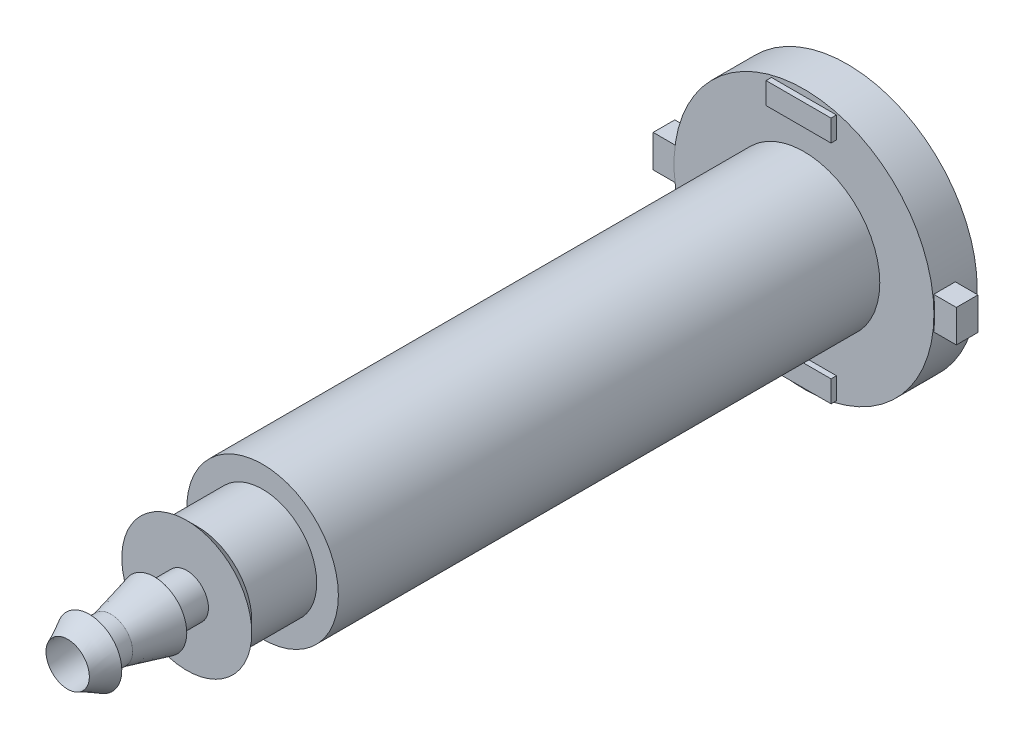
ISO-10303-21;
HEADER;
FILE_DESCRIPTION(('STEP AP214'),'2;1');
FILE_NAME('part.step','',(''),(''),'','','');
FILE_SCHEMA(('AUTOMOTIVE_DESIGN { 1 0 10303 214 1 1 1 1 }'));
ENDSEC;
DATA;
#1=APPLICATION_CONTEXT('core data for automotive mechanical design processes');
#2=APPLICATION_PROTOCOL_DEFINITION('international standard','automotive_design',2000,#1);
#3=PRODUCT_CONTEXT('',#1,'mechanical');
#4=PRODUCT('Part','Part','',(#3));
#5=PRODUCT_RELATED_PRODUCT_CATEGORY('part','',(#4));
#6=PRODUCT_DEFINITION_FORMATION('','',#4);
#7=PRODUCT_DEFINITION_CONTEXT('part definition',#1,'design');
#8=PRODUCT_DEFINITION('design','',#6,#7);
#9=PRODUCT_DEFINITION_SHAPE('','',#8);
#10=(LENGTH_UNIT() NAMED_UNIT(*) SI_UNIT(.MILLI.,.METRE.));
#11=(NAMED_UNIT(*) PLANE_ANGLE_UNIT() SI_UNIT($,.RADIAN.));
#12=(NAMED_UNIT(*) SI_UNIT($,.STERADIAN.) SOLID_ANGLE_UNIT());
#13=UNCERTAINTY_MEASURE_WITH_UNIT(LENGTH_MEASURE(1.E-05),#10,'distance_accuracy_value','');
#14=(GEOMETRIC_REPRESENTATION_CONTEXT(3) GLOBAL_UNCERTAINTY_ASSIGNED_CONTEXT((#13)) GLOBAL_UNIT_ASSIGNED_CONTEXT((#10,
#11,#12)) REPRESENTATION_CONTEXT('',''));
#15=CARTESIAN_POINT('',(0.,0.,0.));
#16=DIRECTION('',(0.,0.,1.));
#17=DIRECTION('',(1.,0.,0.));
#18=AXIS2_PLACEMENT_3D('',#15,#16,#17);
#19=CARTESIAN_POINT('',(0.,0.,9.));
#20=DIRECTION('',(0.,0.,-1.));
#21=DIRECTION('',(-1.,0.,0.));
#22=AXIS2_PLACEMENT_3D('',#19,#20,#21);
#23=CYLINDRICAL_SURFACE('',#22,9.);
#24=CARTESIAN_POINT('',(0.,0.,9.));
#25=DIRECTION('',(0.,0.,1.));
#26=DIRECTION('',(1.,0.,0.));
#27=AXIS2_PLACEMENT_3D('',#24,#25,#26);
#28=CIRCLE('',#27,9.);
#29=CARTESIAN_POINT('',(9.,0.,9.));
#30=VERTEX_POINT('',#29);
#31=EDGE_CURVE('E483',#30,#30,#28,.T.);
#32=ORIENTED_EDGE('',*,*,#31,.F.);
#33=EDGE_LOOP('',(#32));
#34=FACE_BOUND('',#33,.T.);
#35=CARTESIAN_POINT('',(0.,0.,8.));
#36=DIRECTION('',(0.,0.,-1.));
#37=DIRECTION('',(-1.,0.,0.));
#38=AXIS2_PLACEMENT_3D('',#35,#36,#37);
#39=CIRCLE('',#38,9.);
#40=CARTESIAN_POINT('',(-9.,0.,8.));
#41=VERTEX_POINT('',#40);
#42=EDGE_CURVE('E183',#41,#41,#39,.T.);
#43=ORIENTED_EDGE('',*,*,#42,.F.);
#44=EDGE_LOOP('',(#43));
#45=FACE_BOUND('',#44,.T.);
#46=ADVANCED_FACE('F50',(#34,#45),#23,.T.);
#47=CARTESIAN_POINT('',(0.,0.,13.));
#48=DIRECTION('',(0.,0.,-1.));
#49=DIRECTION('',(-1.,0.,0.));
#50=AXIS2_PLACEMENT_3D('',#47,#48,#49);
#51=CYLINDRICAL_SURFACE('',#50,12.);
#52=CARTESIAN_POINT('',(0.,0.,10.9298599072825));
#53=DIRECTION('',(0.,0.,1.));
#54=DIRECTION('',(1.,0.,0.));
#55=AXIS2_PLACEMENT_3D('',#52,#53,#54);
#56=CIRCLE('',#55,12.);
#57=CARTESIAN_POINT('',(11.9058808997907,-1.5,10.9298599072825));
#58=VERTEX_POINT('',#57);
#59=CARTESIAN_POINT('',(11.9058808997907,1.5,10.9298599072825));
#60=VERTEX_POINT('',#59);
#61=EDGE_CURVE('E410',#58,#60,#56,.T.);
#62=ORIENTED_EDGE('',*,*,#61,.F.);
#63=DIRECTION('',(0.,0.,-1.));
#64=VECTOR('',#63,1.);
#65=CARTESIAN_POINT('',(11.9058808997907,-1.5,13.));
#66=LINE('',#65,#64);
#67=CARTESIAN_POINT('',(11.9058808997907,-1.5,12.9298599072825));
#68=VERTEX_POINT('',#67);
#69=EDGE_CURVE('E422',#68,#58,#66,.T.);
#70=ORIENTED_EDGE('',*,*,#69,.F.);
#71=CARTESIAN_POINT('',(0.,0.,12.9298599072825));
#72=DIRECTION('',(0.,0.,-1.));
#73=DIRECTION('',(-1.,0.,0.));
#74=AXIS2_PLACEMENT_3D('',#71,#72,#73);
#75=CIRCLE('',#74,12.);
#76=CARTESIAN_POINT('',(11.9058808997907,1.5,12.9298599072825));
#77=VERTEX_POINT('',#76);
#78=EDGE_CURVE('E418',#77,#68,#75,.T.);
#79=ORIENTED_EDGE('',*,*,#78,.F.);
#80=DIRECTION('',(0.,0.,-1.));
#81=VECTOR('',#80,1.);
#82=CARTESIAN_POINT('',(11.9058808997907,1.5,13.));
#83=LINE('',#82,#81);
#84=EDGE_CURVE('E414',#60,#77,#83,.F.);
#85=ORIENTED_EDGE('',*,*,#84,.F.);
#86=EDGE_LOOP('',(#62,#70,#79,#85));
#87=FACE_BOUND('',#86,.T.);
#88=CARTESIAN_POINT('',(0.,0.,13.));
#89=DIRECTION('',(0.,0.,1.));
#90=DIRECTION('',(1.,0.,0.));
#91=AXIS2_PLACEMENT_3D('',#88,#89,#90);
#92=CIRCLE('',#91,12.);
#93=CARTESIAN_POINT('',(12.,0.,13.));
#94=VERTEX_POINT('',#93);
#95=EDGE_CURVE('E951',#94,#94,#92,.T.);
#96=ORIENTED_EDGE('',*,*,#95,.F.);
#97=EDGE_LOOP('',(#96));
#98=FACE_BOUND('',#97,.T.);
#99=CARTESIAN_POINT('',(0.,0.,9.));
#100=DIRECTION('',(0.,0.,1.));
#101=DIRECTION('',(1.,0.,0.));
#102=AXIS2_PLACEMENT_3D('',#99,#100,#101);
#103=CIRCLE('',#102,12.);
#104=CARTESIAN_POINT('',(12.,0.,9.));
#105=VERTEX_POINT('',#104);
#106=EDGE_CURVE('E926',#105,#105,#103,.T.);
#107=ORIENTED_EDGE('',*,*,#106,.T.);
#108=EDGE_LOOP('',(#107));
#109=FACE_BOUND('',#108,.T.);
#110=CARTESIAN_POINT('',(0.,0.,10.9298599072825));
#111=DIRECTION('',(0.,0.,1.));
#112=DIRECTION('',(1.,0.,0.));
#113=AXIS2_PLACEMENT_3D('',#110,#111,#112);
#114=CIRCLE('',#113,12.);
#115=CARTESIAN_POINT('',(-11.9058808997907,1.5,10.9298599072825));
#116=VERTEX_POINT('',#115);
#117=CARTESIAN_POINT('',(-11.9058808997907,-1.5,10.9298599072825));
#118=VERTEX_POINT('',#117);
#119=EDGE_CURVE('E12',#116,#118,#114,.T.);
#120=ORIENTED_EDGE('',*,*,#119,.F.);
#121=DIRECTION('',(0.,0.,-1.));
#122=VECTOR('',#121,1.);
#123=CARTESIAN_POINT('',(-11.9058808997907,1.5,13.));
#124=LINE('',#123,#122);
#125=CARTESIAN_POINT('',(-11.9058808997907,1.5,12.9298599072825));
#126=VERTEX_POINT('',#125);
#127=EDGE_CURVE('E406',#126,#116,#124,.T.);
#128=ORIENTED_EDGE('',*,*,#127,.F.);
#129=CARTESIAN_POINT('',(0.,0.,12.9298599072825));
#130=DIRECTION('',(0.,0.,-1.));
#131=DIRECTION('',(-1.,0.,0.));
#132=AXIS2_PLACEMENT_3D('',#129,#130,#131);
#133=CIRCLE('',#132,12.);
#134=CARTESIAN_POINT('',(-11.9058808997907,-1.5,12.9298599072825));
#135=VERTEX_POINT('',#134);
#136=EDGE_CURVE('E71',#135,#126,#133,.T.);
#137=ORIENTED_EDGE('',*,*,#136,.F.);
#138=DIRECTION('',(0.,0.,-1.));
#139=VECTOR('',#138,1.);
#140=CARTESIAN_POINT('',(-11.9058808997907,-1.5,13.));
#141=LINE('',#140,#139);
#142=EDGE_CURVE('E60',#118,#135,#141,.F.);
#143=ORIENTED_EDGE('',*,*,#142,.F.);
#144=EDGE_LOOP('',(#120,#128,#137,#143));
#145=FACE_BOUND('',#144,.T.);
#146=ADVANCED_FACE('F458',(#87,#98,#109,#145),#51,.T.);
#147=CARTESIAN_POINT('',(0.,0.,13.));
#148=DIRECTION('',(0.,0.,1.));
#149=DIRECTION('',(1.,0.,0.));
#150=AXIS2_PLACEMENT_3D('',#147,#148,#149);
#151=PLANE('',#150);
#152=CARTESIAN_POINT('',(0.,0.,13.));
#153=DIRECTION('',(0.,0.,1.));
#154=DIRECTION('',(1.,0.,0.));
#155=AXIS2_PLACEMENT_3D('',#152,#153,#154);
#156=CIRCLE('',#155,7.);
#157=CARTESIAN_POINT('',(7.,0.,13.));
#158=VERTEX_POINT('',#157);
#159=EDGE_CURVE('E930',#158,#158,#156,.T.);
#160=ORIENTED_EDGE('',*,*,#159,.F.);
#161=EDGE_LOOP('',(#160));
#162=FACE_BOUND('',#161,.T.);
#163=ORIENTED_EDGE('',*,*,#95,.T.);
#164=EDGE_LOOP('',(#163));
#165=FACE_BOUND('',#164,.T.);
#166=DIRECTION('',(-1.,0.,0.));
#167=VECTOR('',#166,1.);
#168=CARTESIAN_POINT('',(-3.,11.4282177049732,13.));
#169=LINE('',#168,#167);
#170=CARTESIAN_POINT('',(3.,11.4282177049732,13.));
#171=VERTEX_POINT('',#170);
#172=CARTESIAN_POINT('',(-3.,11.4282177049732,13.));
#173=VERTEX_POINT('',#172);
#174=EDGE_CURVE('E283',#171,#173,#169,.T.);
#175=ORIENTED_EDGE('',*,*,#174,.F.);
#176=DIRECTION('',(0.,1.,0.));
#177=VECTOR('',#176,1.);
#178=CARTESIAN_POINT('',(3.,11.4282177049732,13.));
#179=LINE('',#178,#177);
#180=CARTESIAN_POINT('',(3.,9.42821770497322,13.));
#181=VERTEX_POINT('',#180);
#182=EDGE_CURVE('E264',#181,#171,#179,.T.);
#183=ORIENTED_EDGE('',*,*,#182,.F.);
#184=DIRECTION('',(1.,0.,0.));
#185=VECTOR('',#184,1.);
#186=CARTESIAN_POINT('',(-3.,9.42821770497322,13.));
#187=LINE('',#186,#185);
#188=CARTESIAN_POINT('',(-3.,9.42821770497322,13.));
#189=VERTEX_POINT('',#188);
#190=EDGE_CURVE('E270',#189,#181,#187,.T.);
#191=ORIENTED_EDGE('',*,*,#190,.F.);
#192=DIRECTION('',(0.,-1.,0.));
#193=VECTOR('',#192,1.);
#194=CARTESIAN_POINT('',(-3.,11.4282177049732,13.));
#195=LINE('',#194,#193);
#196=EDGE_CURVE('E286',#173,#189,#195,.T.);
#197=ORIENTED_EDGE('',*,*,#196,.F.);
#198=EDGE_LOOP('',(#175,#183,#191,#197));
#199=FACE_BOUND('',#198,.T.);
#200=DIRECTION('',(1.,0.,0.));
#201=VECTOR('',#200,1.);
#202=CARTESIAN_POINT('',(3.,-11.4282177049732,13.));
#203=LINE('',#202,#201);
#204=CARTESIAN_POINT('',(-3.,-11.4282177049732,13.));
#205=VERTEX_POINT('',#204);
#206=CARTESIAN_POINT('',(3.,-11.4282177049732,13.));
#207=VERTEX_POINT('',#206);
#208=EDGE_CURVE('E193',#205,#207,#203,.T.);
#209=ORIENTED_EDGE('',*,*,#208,.F.);
#210=DIRECTION('',(0.,-1.,0.));
#211=VECTOR('',#210,1.);
#212=CARTESIAN_POINT('',(-3.,-11.4282177049732,13.));
#213=LINE('',#212,#211);
#214=CARTESIAN_POINT('',(-3.,-9.42821770497322,13.));
#215=VERTEX_POINT('',#214);
#216=EDGE_CURVE('E187',#215,#205,#213,.T.);
#217=ORIENTED_EDGE('',*,*,#216,.F.);
#218=DIRECTION('',(-1.,0.,0.));
#219=VECTOR('',#218,1.);
#220=CARTESIAN_POINT('',(3.,-9.42821770497322,13.));
#221=LINE('',#220,#219);
#222=CARTESIAN_POINT('',(3.,-9.42821770497322,13.));
#223=VERTEX_POINT('',#222);
#224=EDGE_CURVE('E204',#223,#215,#221,.T.);
#225=ORIENTED_EDGE('',*,*,#224,.F.);
#226=DIRECTION('',(0.,1.,0.));
#227=VECTOR('',#226,1.);
#228=CARTESIAN_POINT('',(3.,-11.4282177049732,13.));
#229=LINE('',#228,#227);
#230=EDGE_CURVE('E216',#207,#223,#229,.T.);
#231=ORIENTED_EDGE('',*,*,#230,.F.);
#232=EDGE_LOOP('',(#209,#217,#225,#231));
#233=FACE_BOUND('',#232,.T.);
#234=ADVANCED_FACE('F455',(#162,#165,#199,#233),#151,.T.);
#235=CARTESIAN_POINT('',(0.,0.,81.));
#236=DIRECTION('',(0.,0.,-1.));
#237=DIRECTION('',(-1.,0.,0.));
#238=AXIS2_PLACEMENT_3D('',#235,#236,#237);
#239=CYLINDRICAL_SURFACE('',#238,2.);
#240=CARTESIAN_POINT('',(0.,0.,70.));
#241=DIRECTION('',(0.,0.,1.));
#242=DIRECTION('',(1.,0.,0.));
#243=AXIS2_PLACEMENT_3D('',#240,#241,#242);
#244=CIRCLE('',#243,2.);
#245=CARTESIAN_POINT('',(2.,0.,70.));
#246=VERTEX_POINT('',#245);
#247=EDGE_CURVE('E918',#246,#246,#244,.T.);
#248=ORIENTED_EDGE('',*,*,#247,.T.);
#249=EDGE_LOOP('',(#248));
#250=FACE_BOUND('',#249,.T.);
#251=CARTESIAN_POINT('',(0.,0.,73.));
#252=DIRECTION('',(0.,0.,1.));
#253=DIRECTION('',(1.,0.,0.));
#254=AXIS2_PLACEMENT_3D('',#251,#252,#253);
#255=CIRCLE('',#254,2.);
#256=CARTESIAN_POINT('',(2.,0.,73.));
#257=VERTEX_POINT('',#256);
#258=EDGE_CURVE('E426',#257,#257,#255,.T.);
#259=ORIENTED_EDGE('',*,*,#258,.F.);
#260=EDGE_LOOP('',(#259));
#261=FACE_BOUND('',#260,.T.);
#262=ADVANCED_FACE('F447',(#250,#261),#239,.T.);
#263=CARTESIAN_POINT('',(0.,0.,9.));
#264=DIRECTION('',(0.,0.,1.));
#265=DIRECTION('',(1.,0.,0.));
#266=AXIS2_PLACEMENT_3D('',#263,#264,#265);
#267=PLANE('',#266);
#268=ORIENTED_EDGE('',*,*,#31,.T.);
#269=EDGE_LOOP('',(#268));
#270=FACE_BOUND('',#269,.T.);
#271=ORIENTED_EDGE('',*,*,#106,.F.);
#272=EDGE_LOOP('',(#271));
#273=FACE_BOUND('',#272,.T.);
#274=ADVANCED_FACE('F460',(#270,#273),#267,.F.);
#275=CARTESIAN_POINT('',(0.,0.,63.));
#276=DIRECTION('',(0.,0.,1.));
#277=DIRECTION('',(1.,0.,0.));
#278=AXIS2_PLACEMENT_3D('',#275,#276,#277);
#279=PLANE('',#278);
#280=CARTESIAN_POINT('',(0.,0.,63.));
#281=DIRECTION('',(0.,0.,1.));
#282=DIRECTION('',(1.,0.,0.));
#283=AXIS2_PLACEMENT_3D('',#280,#281,#282);
#284=CIRCLE('',#283,5.);
#285=CARTESIAN_POINT('',(5.,0.,63.));
#286=VERTEX_POINT('',#285);
#287=EDGE_CURVE('E936',#286,#286,#284,.T.);
#288=ORIENTED_EDGE('',*,*,#287,.F.);
#289=EDGE_LOOP('',(#288));
#290=FACE_BOUND('',#289,.T.);
#291=CARTESIAN_POINT('',(0.,0.,63.));
#292=DIRECTION('',(0.,0.,1.));
#293=DIRECTION('',(1.,0.,0.));
#294=AXIS2_PLACEMENT_3D('',#291,#292,#293);
#295=CIRCLE('',#294,7.);
#296=CARTESIAN_POINT('',(7.,0.,63.));
#297=VERTEX_POINT('',#296);
#298=EDGE_CURVE('E947',#297,#297,#295,.T.);
#299=ORIENTED_EDGE('',*,*,#298,.T.);
#300=EDGE_LOOP('',(#299));
#301=FACE_BOUND('',#300,.T.);
#302=ADVANCED_FACE('F463',(#290,#301),#279,.T.);
#303=CARTESIAN_POINT('',(0.,0.,63.));
#304=DIRECTION('',(0.,0.,-1.));
#305=DIRECTION('',(-1.,0.,0.));
#306=AXIS2_PLACEMENT_3D('',#303,#304,#305);
#307=CYLINDRICAL_SURFACE('',#306,7.);
#308=ORIENTED_EDGE('',*,*,#159,.T.);
#309=EDGE_LOOP('',(#308));
#310=FACE_BOUND('',#309,.T.);
#311=ORIENTED_EDGE('',*,*,#298,.F.);
#312=EDGE_LOOP('',(#311));
#313=FACE_BOUND('',#312,.T.);
#314=ADVANCED_FACE('F453',(#310,#313),#307,.T.);
#315=CARTESIAN_POINT('',(0.,0.,69.));
#316=DIRECTION('',(0.,0.,-1.));
#317=DIRECTION('',(-1.,0.,0.));
#318=AXIS2_PLACEMENT_3D('',#315,#316,#317);
#319=CYLINDRICAL_SURFACE('',#318,5.);
#320=CARTESIAN_POINT('',(0.,0.,69.));
#321=DIRECTION('',(0.,0.,1.));
#322=DIRECTION('',(1.,0.,0.));
#323=AXIS2_PLACEMENT_3D('',#320,#321,#322);
#324=CIRCLE('',#323,5.);
#325=CARTESIAN_POINT('',(5.,0.,69.));
#326=VERTEX_POINT('',#325);
#327=EDGE_CURVE('E920',#326,#326,#324,.T.);
#328=ORIENTED_EDGE('',*,*,#327,.F.);
#329=EDGE_LOOP('',(#328));
#330=FACE_BOUND('',#329,.T.);
#331=ORIENTED_EDGE('',*,*,#287,.T.);
#332=EDGE_LOOP('',(#331));
#333=FACE_BOUND('',#332,.T.);
#334=ADVANCED_FACE('F450',(#330,#333),#319,.T.);
#335=CARTESIAN_POINT('',(0.,0.,70.));
#336=DIRECTION('',(0.,0.,1.));
#337=DIRECTION('',(1.,0.,0.));
#338=AXIS2_PLACEMENT_3D('',#335,#336,#337);
#339=PLANE('',#338);
#340=CARTESIAN_POINT('',(0.,0.,70.));
#341=DIRECTION('',(0.,0.,1.));
#342=DIRECTION('',(1.,0.,0.));
#343=AXIS2_PLACEMENT_3D('',#340,#341,#342);
#344=CIRCLE('',#343,6.);
#345=CARTESIAN_POINT('',(6.,0.,70.));
#346=VERTEX_POINT('',#345);
#347=EDGE_CURVE('E914',#346,#346,#344,.T.);
#348=ORIENTED_EDGE('',*,*,#347,.T.);
#349=EDGE_LOOP('',(#348));
#350=FACE_BOUND('',#349,.T.);
#351=ORIENTED_EDGE('',*,*,#247,.F.);
#352=EDGE_LOOP('',(#351));
#353=FACE_BOUND('',#352,.T.);
#354=ADVANCED_FACE('F381',(#350,#353),#339,.T.);
#355=CARTESIAN_POINT('',(0.,0.,69.));
#356=DIRECTION('',(0.,0.,1.));
#357=DIRECTION('',(1.,0.,0.));
#358=AXIS2_PLACEMENT_3D('',#355,#356,#357);
#359=CONICAL_SURFACE('',#358,5.,0.785398163397455);
#360=ORIENTED_EDGE('',*,*,#347,.F.);
#361=EDGE_LOOP('',(#360));
#362=FACE_BOUND('',#361,.T.);
#363=ORIENTED_EDGE('',*,*,#327,.T.);
#364=EDGE_LOOP('',(#363));
#365=FACE_BOUND('',#364,.T.);
#366=ADVANCED_FACE('F448',(#362,#365),#359,.T.);
#367=CARTESIAN_POINT('',(0.,0.,73.));
#368=DIRECTION('',(0.,0.,1.));
#369=DIRECTION('',(1.,0.,0.));
#370=AXIS2_PLACEMENT_3D('',#367,#368,#369);
#371=PLANE('',#370);
#372=ORIENTED_EDGE('',*,*,#258,.T.);
#373=EDGE_LOOP('',(#372));
#374=FACE_BOUND('',#373,.T.);
#375=CARTESIAN_POINT('',(0.,0.,73.));
#376=DIRECTION('',(0.,0.,1.));
#377=DIRECTION('',(1.,0.,0.));
#378=AXIS2_PLACEMENT_3D('',#375,#376,#377);
#379=CIRCLE('',#378,3.);
#380=CARTESIAN_POINT('',(3.,0.,73.));
#381=VERTEX_POINT('',#380);
#382=EDGE_CURVE('E305',#381,#381,#379,.T.);
#383=ORIENTED_EDGE('',*,*,#382,.F.);
#384=EDGE_LOOP('',(#383));
#385=FACE_BOUND('',#384,.T.);
#386=ADVANCED_FACE('F327',(#374,#385),#371,.F.);
#387=CARTESIAN_POINT('',(0.,0.,77.));
#388=DIRECTION('',(0.,0.,-1.));
#389=DIRECTION('',(-1.,0.,0.));
#390=AXIS2_PLACEMENT_3D('',#387,#388,#389);
#391=CONICAL_SURFACE('',#390,2.,0.244978663126864);
#392=ORIENTED_EDGE('',*,*,#382,.T.);
#393=EDGE_LOOP('',(#392));
#394=FACE_BOUND('',#393,.T.);
#395=CARTESIAN_POINT('',(0.,0.,77.));
#396=DIRECTION('',(0.,0.,1.));
#397=DIRECTION('',(1.,0.,0.));
#398=AXIS2_PLACEMENT_3D('',#395,#396,#397);
#399=CIRCLE('',#398,2.);
#400=CARTESIAN_POINT('',(2.,0.,77.));
#401=VERTEX_POINT('',#400);
#402=EDGE_CURVE('E354',#401,#401,#399,.T.);
#403=ORIENTED_EDGE('',*,*,#402,.F.);
#404=EDGE_LOOP('',(#403));
#405=FACE_BOUND('',#404,.T.);
#406=ADVANCED_FACE('F316',(#394,#405),#391,.T.);
#407=CARTESIAN_POINT('',(2.57548448362531,1.53846666346894,79.));
#408=CARTESIAN_POINT('',(1.96824268909109,0.354993967328283,81.));
#409=CARTESIAN_POINT('',(-0.501448843312568,6.68943563071957,79.));
#410=CARTESIAN_POINT('',(1.25825475443452,4.29147934551046,81.));
#411=CARTESIAN_POINT('',(-5.65241781056319,3.61250230378168,79.));
#412=CARTESIAN_POINT('',(-2.67823062374765,3.5814914108539,81.));
#413=CARTESIAN_POINT('',(-2.57548448362531,-1.53846666346894,79.));
#414=CARTESIAN_POINT('',(-1.96824268909109,-0.354993967328282,81.));
#415=CARTESIAN_POINT('',(0.501448843312567,-6.68943563071956,79.));
#416=CARTESIAN_POINT('',(-1.25825475443453,-4.29147934551046,81.));
#417=CARTESIAN_POINT('',(5.65241781056319,-3.61250230378168,79.));
#418=CARTESIAN_POINT('',(2.67823062374766,-3.5814914108539,81.));
#419=CARTESIAN_POINT('',(2.57548448362531,1.53846666346894,79.));
#420=CARTESIAN_POINT('',(1.96824268909109,0.354993967328283,81.));
#421=(BOUNDED_SURFACE() B_SPLINE_SURFACE(3,1,((#407,#408),(#409,#410),(#411,#412),(#413,#414),
(#415,#416),(#417,#418),(#419,#420)),.UNSPECIFIED.,.T.,.F.,.F.) B_SPLINE_SURFACE_WITH_KNOTS((4,
3,4),(2,2),(0.,0.5,1.),(0.,1.),
.UNSPECIFIED.) GEOMETRIC_REPRESENTATION_ITEM() RATIONAL_B_SPLINE_SURFACE(((1.,1.),
(0.333333333333333,0.333333333333333),(0.333333333333333,0.333333333333333),(1.,1.),
(0.333333333333334,0.333333333333333),(0.333333333333334,0.333333333333333),(1.,1.))) REPRESENTATION_ITEM('') SURFACE());
#422=CARTESIAN_POINT('',(0.,0.,79.));
#423=DIRECTION('',(0.,0.,1.));
#424=DIRECTION('',(1.,0.,0.));
#425=AXIS2_PLACEMENT_3D('',#422,#423,#424);
#426=CIRCLE('',#425,3.);
#427=CARTESIAN_POINT('',(2.57548448362531,1.53846666346894,79.));
#428=VERTEX_POINT('',#427);
#429=EDGE_CURVE('E360',#428,#428,#426,.T.);
#430=CARTESIAN_POINT('',(0.,0.,81.));
#431=DIRECTION('',(0.,0.,1.));
#432=DIRECTION('',(1.,0.,0.));
#433=AXIS2_PLACEMENT_3D('',#430,#431,#432);
#434=CIRCLE('',#433,2.);
#435=CARTESIAN_POINT('',(1.96824268909109,0.354993967328283,81.));
#436=VERTEX_POINT('',#435);
#437=EDGE_CURVE('E53',#436,#436,#434,.F.);
#438=CARTESIAN_POINT('',(2.57548448362531,1.53846666346894,79.));
#439=CARTESIAN_POINT('',(2.56915904826558,1.52613882288414,79.0208333333333));
#440=CARTESIAN_POINT('',(2.56283361290585,1.51381098229934,79.0416666666666));
#441=CARTESIAN_POINT('',(2.55018274218639,1.48915530112975,79.0833333333333));
#442=CARTESIAN_POINT('',(2.54385730682666,1.47682746054495,79.1041666666667));
#443=CARTESIAN_POINT('',(2.53120643610719,1.45217177937535,79.1458333333333));
#444=CARTESIAN_POINT('',(2.52488100074746,1.43984393879055,79.1666666666666));
#445=CARTESIAN_POINT('',(2.512230130028,1.41518825762095,79.2083333333333));
#446=CARTESIAN_POINT('',(2.50590469466827,1.40286041703616,79.2291666666667));
#447=CARTESIAN_POINT('',(2.4932538239488,1.37820473586656,79.2708333333333));
#448=CARTESIAN_POINT('',(2.48692838858907,1.36587689528176,79.2916666666666));
#449=CARTESIAN_POINT('',(2.47427751786961,1.34122121411216,79.3333333333333));
#450=CARTESIAN_POINT('',(2.46795208250988,1.32889337352737,79.3541666666667));
#451=CARTESIAN_POINT('',(2.45530121179042,1.30423769235777,79.3958333333333));
#452=CARTESIAN_POINT('',(2.44897577643068,1.29190985177297,79.4166666666667));
#453=CARTESIAN_POINT('',(2.43632490571122,1.26725417060337,79.4583333333333));
#454=CARTESIAN_POINT('',(2.42999947035149,1.25492633001857,79.4791666666667));
#455=CARTESIAN_POINT('',(2.41734859963203,1.23027064884898,79.5208333333333));
#456=CARTESIAN_POINT('',(2.41102316427229,1.21794280826418,79.5416666666667));
#457=CARTESIAN_POINT('',(2.39837229355283,1.19328712709458,79.5833333333333));
#458=CARTESIAN_POINT('',(2.3920468581931,1.18095928650978,79.6041666666667));
#459=CARTESIAN_POINT('',(2.37939598747364,1.15630360534019,79.6458333333333));
#460=CARTESIAN_POINT('',(2.37307055211391,1.14397576475539,79.6666666666667));
#461=CARTESIAN_POINT('',(2.36041968139444,1.11932008358579,79.7083333333333));
#462=CARTESIAN_POINT('',(2.35409424603471,1.10699224300099,79.7291666666667));
#463=CARTESIAN_POINT('',(2.34144337531525,1.08233656183139,79.7708333333333));
#464=CARTESIAN_POINT('',(2.33511793995552,1.07000872124659,79.7916666666666));
#465=CARTESIAN_POINT('',(2.32246706923605,1.045353040077,79.8333333333333));
#466=CARTESIAN_POINT('',(2.31614163387632,1.0330251994922,79.8541666666667));
#467=CARTESIAN_POINT('',(2.30349076315686,1.00836951832261,79.8958333333333));
#468=CARTESIAN_POINT('',(2.29716532779713,0.996041677737807,79.9166666666667));
#469=CARTESIAN_POINT('',(2.28451445707766,0.971385996568208,79.9583333333333));
#470=CARTESIAN_POINT('',(2.27818902171793,0.959058155983409,79.9791666666667));
#471=CARTESIAN_POINT('',(2.26553815099847,0.934402474813813,80.0208333333333));
#472=CARTESIAN_POINT('',(2.25921271563874,0.922074634229014,80.0416666666667));
#473=CARTESIAN_POINT('',(2.24656184491928,0.897418953059418,80.0833333333333));
#474=CARTESIAN_POINT('',(2.24023640955955,0.88509111247462,80.1041666666667));
#475=CARTESIAN_POINT('',(2.22758553884008,0.860435431305023,80.1458333333333));
#476=CARTESIAN_POINT('',(2.22126010348035,0.848107590720223,80.1666666666667));
#477=CARTESIAN_POINT('',(2.20860923276089,0.823451909550626,80.2083333333333));
#478=CARTESIAN_POINT('',(2.20228379740116,0.811124068965829,80.2291666666667));
#479=CARTESIAN_POINT('',(2.18963292668169,0.786468387796232,80.2708333333333));
#480=CARTESIAN_POINT('',(2.18330749132196,0.774140547211432,80.2916666666667));
#481=CARTESIAN_POINT('',(2.1706566206025,0.749484866041835,80.3333333333333));
#482=CARTESIAN_POINT('',(2.16433118524277,0.737157025457038,80.3541666666667));
#483=CARTESIAN_POINT('',(2.1516803145233,0.712501344287441,80.3958333333333));
#484=CARTESIAN_POINT('',(2.14535487916357,0.700173503702642,80.4166666666667));
#485=CARTESIAN_POINT('',(2.13270400844411,0.675517822533044,80.4583333333333));
#486=CARTESIAN_POINT('',(2.12637857308438,0.663189981948244,80.4791666666667));
#487=CARTESIAN_POINT('',(2.11372770236491,0.638534300778648,80.5208333333333));
#488=CARTESIAN_POINT('',(2.10740226700518,0.626206460193852,80.5416666666667));
#489=CARTESIAN_POINT('',(2.09475139628572,0.601550779024254,80.5833333333333));
#490=CARTESIAN_POINT('',(2.08842596092599,0.589222938439453,80.6041666666667));
#491=CARTESIAN_POINT('',(2.07577509020652,0.564567257269856,80.6458333333333));
#492=CARTESIAN_POINT('',(2.0694496548468,0.552239416685061,80.6666666666667));
#493=CARTESIAN_POINT('',(2.05679878412733,0.527583735515464,80.7083333333333));
#494=CARTESIAN_POINT('',(2.0504733487676,0.515255894930663,80.7291666666667));
#495=CARTESIAN_POINT('',(2.03782247804814,0.490600213761065,80.7708333333333));
#496=CARTESIAN_POINT('',(2.03149704268841,0.478272373176269,80.7916666666667));
#497=CARTESIAN_POINT('',(2.01884617196894,0.453616692006672,80.8333333333333));
#498=CARTESIAN_POINT('',(2.01252073660921,0.441288851421872,80.8541666666667));
#499=CARTESIAN_POINT('',(1.99986986588975,0.416633170252274,80.8958333333333));
#500=CARTESIAN_POINT('',(1.99354443053002,0.404305329667477,80.9166666666667));
#501=CARTESIAN_POINT('',(1.98089355981055,0.379649648497882,80.9583333333333));
#502=CARTESIAN_POINT('',(1.97456812445082,0.367321807913084,80.9791666666667));
#503=CARTESIAN_POINT('',(1.96824268909109,0.354993967328283,81.));
#504=B_SPLINE_CURVE_WITH_KNOTS('',3,(#438,#439,#440,#441,#442,#443,#444,#445,#446,#447,#448,
#449,#450,#451,#452,#453,#454,#455,#456,#457,#458,#459,#460,#461,#462,#463,#464,#465,#466,#467,
#468,#469,#470,#471,#472,#473,#474,#475,#476,#477,#478,#479,#480,#481,#482,#483,#484,#485,#486,
#487,#488,#489,#490,#491,#492,#493,#494,#495,#496,#497,#498,#499,#500,#501,#502,#503),
.UNSPECIFIED.,.F.,.F.,(4,2,2,2,2,2,2,2,2,2,2,2,2,2,2,2,2,2,2,2,2,2,2,2,2,2,2,2,2,2,2,2,4),(0.,
0.075060849141002,0.150121698282016,0.225182547423018,0.300243396564031,0.375304245705033,
0.450365094846058,0.52542594398706,0.600486793128062,0.675547642269076,0.75060849141009,
0.825669340551092,0.900730189692094,0.975791038833096,1.05085188797412,1.12591273711512,
1.20097358625612,1.27603443539714,1.35109528453815,1.42615613367915,1.50121698282017,
1.57627783196117,1.65133868110218,1.72639953024318,1.80146037938419,1.8765212285252,
1.9515820776662,2.02664292680723,2.10170377594823,2.17676462508924,2.25182547423024,
2.32688632337126,2.40194717251226),.UNSPECIFIED.);
#505=EDGE_CURVE('BSEAM326',#428,#436,#504,.T.);
#506=ORIENTED_EDGE('',*,*,#429,.T.);
#507=ORIENTED_EDGE('',*,*,#437,.T.);
#508=ORIENTED_EDGE('',*,*,#505,.T.);
#509=ORIENTED_EDGE('',*,*,#505,.F.);
#510=EDGE_LOOP('',(#506,#508,#507,#509));
#511=FACE_BOUND('',#510,.T.);
#512=ADVANCED_FACE('F326',(#511),#421,.T.);
#513=CARTESIAN_POINT('',(0.,0.,79.));
#514=DIRECTION('',(0.,0.,1.));
#515=DIRECTION('',(1.,0.,0.));
#516=AXIS2_PLACEMENT_3D('',#513,#514,#515);
#517=PLANE('',#516);
#518=ORIENTED_EDGE('',*,*,#429,.F.);
#519=EDGE_LOOP('',(#518));
#520=FACE_BOUND('',#519,.T.);
#521=CARTESIAN_POINT('',(0.,0.,79.));
#522=DIRECTION('',(0.,0.,1.));
#523=DIRECTION('',(1.,0.,0.));
#524=AXIS2_PLACEMENT_3D('',#521,#522,#523);
#525=CIRCLE('',#524,2.);
#526=CARTESIAN_POINT('',(2.,0.,79.));
#527=VERTEX_POINT('',#526);
#528=EDGE_CURVE('E430',#527,#527,#525,.T.);
#529=ORIENTED_EDGE('',*,*,#528,.T.);
#530=EDGE_LOOP('',(#529));
#531=FACE_BOUND('',#530,.T.);
#532=ADVANCED_FACE('F330',(#520,#531),#517,.F.);
#533=ORIENTED_EDGE('',*,*,#402,.T.);
#534=EDGE_LOOP('',(#533));
#535=FACE_BOUND('',#534,.T.);
#536=ORIENTED_EDGE('',*,*,#528,.F.);
#537=EDGE_LOOP('',(#536));
#538=FACE_BOUND('',#537,.T.);
#539=ADVANCED_FACE('F436',(#535,#538),#239,.T.);
#540=CARTESIAN_POINT('',(3.,11.4282177049732,13.5));
#541=DIRECTION('',(-1.,0.,0.));
#542=DIRECTION('',(0.,-1.,0.));
#543=AXIS2_PLACEMENT_3D('',#540,#541,#542);
#544=PLANE('',#543);
#545=ORIENTED_EDGE('',*,*,#182,.T.);
#546=DIRECTION('',(0.,0.,-1.));
#547=VECTOR('',#546,1.);
#548=CARTESIAN_POINT('',(3.,11.4282177049732,13.5));
#549=LINE('',#548,#547);
#550=CARTESIAN_POINT('',(3.,11.4282177049732,13.5));
#551=VERTEX_POINT('',#550);
#552=EDGE_CURVE('E302',#551,#171,#549,.T.);
#553=ORIENTED_EDGE('',*,*,#552,.F.);
#554=DIRECTION('',(0.,1.,0.));
#555=VECTOR('',#554,1.);
#556=CARTESIAN_POINT('',(3.,11.4282177049732,13.5));
#557=LINE('',#556,#555);
#558=CARTESIAN_POINT('',(3.,9.42821770497322,13.5));
#559=VERTEX_POINT('',#558);
#560=EDGE_CURVE('E265',#559,#551,#557,.T.);
#561=ORIENTED_EDGE('',*,*,#560,.F.);
#562=DIRECTION('',(0.,0.,-1.));
#563=VECTOR('',#562,1.);
#564=CARTESIAN_POINT('',(3.,9.42821770497322,13.5));
#565=LINE('',#564,#563);
#566=EDGE_CURVE('E279',#559,#181,#565,.T.);
#567=ORIENTED_EDGE('',*,*,#566,.T.);
#568=EDGE_LOOP('',(#545,#553,#561,#567));
#569=FACE_BOUND('',#568,.T.);
#570=ADVANCED_FACE('F445',(#569),#544,.F.);
#571=CARTESIAN_POINT('',(-3.,11.4282177049732,13.5));
#572=DIRECTION('',(0.,-1.,0.));
#573=DIRECTION('',(0.,0.,-1.));
#574=AXIS2_PLACEMENT_3D('',#571,#572,#573);
#575=PLANE('',#574);
#576=ORIENTED_EDGE('',*,*,#174,.T.);
#577=DIRECTION('',(0.,0.,-1.));
#578=VECTOR('',#577,1.);
#579=CARTESIAN_POINT('',(-3.,11.4282177049732,13.5));
#580=LINE('',#579,#578);
#581=CARTESIAN_POINT('',(-3.,11.4282177049732,13.5));
#582=VERTEX_POINT('',#581);
#583=EDGE_CURVE('E298',#582,#173,#580,.T.);
#584=ORIENTED_EDGE('',*,*,#583,.F.);
#585=DIRECTION('',(-1.,0.,0.));
#586=VECTOR('',#585,1.);
#587=CARTESIAN_POINT('',(-3.,11.4282177049732,13.5));
#588=LINE('',#587,#586);
#589=EDGE_CURVE('E269',#551,#582,#588,.T.);
#590=ORIENTED_EDGE('',*,*,#589,.F.);
#591=ORIENTED_EDGE('',*,*,#552,.T.);
#592=EDGE_LOOP('',(#576,#584,#590,#591));
#593=FACE_BOUND('',#592,.T.);
#594=ADVANCED_FACE('F573',(#593),#575,.F.);
#595=CARTESIAN_POINT('',(-3.,11.4282177049732,13.5));
#596=DIRECTION('',(1.,0.,0.));
#597=DIRECTION('',(0.,1.,0.));
#598=AXIS2_PLACEMENT_3D('',#595,#596,#597);
#599=PLANE('',#598);
#600=ORIENTED_EDGE('',*,*,#196,.T.);
#601=DIRECTION('',(0.,0.,-1.));
#602=VECTOR('',#601,1.);
#603=CARTESIAN_POINT('',(-3.,9.42821770497322,13.5));
#604=LINE('',#603,#602);
#605=CARTESIAN_POINT('',(-3.,9.42821770497322,13.5));
#606=VERTEX_POINT('',#605);
#607=EDGE_CURVE('E295',#606,#189,#604,.T.);
#608=ORIENTED_EDGE('',*,*,#607,.F.);
#609=DIRECTION('',(0.,-1.,0.));
#610=VECTOR('',#609,1.);
#611=CARTESIAN_POINT('',(-3.,11.4282177049732,13.5));
#612=LINE('',#611,#610);
#613=EDGE_CURVE('E273',#582,#606,#612,.T.);
#614=ORIENTED_EDGE('',*,*,#613,.F.);
#615=ORIENTED_EDGE('',*,*,#583,.T.);
#616=EDGE_LOOP('',(#600,#608,#614,#615));
#617=FACE_BOUND('',#616,.T.);
#618=ADVANCED_FACE('F569',(#617),#599,.F.);
#619=CARTESIAN_POINT('',(-3.,9.42821770497322,13.5));
#620=DIRECTION('',(0.,1.,0.));
#621=DIRECTION('',(0.,0.,1.));
#622=AXIS2_PLACEMENT_3D('',#619,#620,#621);
#623=PLANE('',#622);
#624=ORIENTED_EDGE('',*,*,#190,.T.);
#625=ORIENTED_EDGE('',*,*,#566,.F.);
#626=DIRECTION('',(1.,0.,0.));
#627=VECTOR('',#626,1.);
#628=CARTESIAN_POINT('',(-3.,9.42821770497322,13.5));
#629=LINE('',#628,#627);
#630=EDGE_CURVE('E276',#606,#559,#629,.T.);
#631=ORIENTED_EDGE('',*,*,#630,.F.);
#632=ORIENTED_EDGE('',*,*,#607,.T.);
#633=EDGE_LOOP('',(#624,#625,#631,#632));
#634=FACE_BOUND('',#633,.T.);
#635=ADVANCED_FACE('F565',(#634),#623,.F.);
#636=CARTESIAN_POINT('',(0.,0.,13.5));
#637=DIRECTION('',(0.,0.,1.));
#638=DIRECTION('',(1.,0.,0.));
#639=AXIS2_PLACEMENT_3D('',#636,#637,#638);
#640=PLANE('',#639);
#641=ORIENTED_EDGE('',*,*,#560,.T.);
#642=ORIENTED_EDGE('',*,*,#589,.T.);
#643=ORIENTED_EDGE('',*,*,#613,.T.);
#644=ORIENTED_EDGE('',*,*,#630,.T.);
#645=EDGE_LOOP('',(#641,#642,#643,#644));
#646=FACE_BOUND('',#645,.T.);
#647=ADVANCED_FACE('F558',(#646),#640,.T.);
#648=CARTESIAN_POINT('',(14.,1.5,12.9298599072825));
#649=DIRECTION('',(0.,-1.,0.));
#650=DIRECTION('',(0.,0.,-1.));
#651=AXIS2_PLACEMENT_3D('',#648,#649,#650);
#652=PLANE('',#651);
#653=DIRECTION('',(-1.,0.,0.));
#654=VECTOR('',#653,1.);
#655=CARTESIAN_POINT('',(14.,1.5,10.9298599072825));
#656=LINE('',#655,#654);
#657=CARTESIAN_POINT('',(14.,1.5,10.9298599072825));
#658=VERTEX_POINT('',#657);
#659=EDGE_CURVE('E260',#658,#60,#656,.T.);
#660=ORIENTED_EDGE('',*,*,#659,.T.);
#661=ORIENTED_EDGE('',*,*,#84,.T.);
#662=DIRECTION('',(-1.,0.,0.));
#663=VECTOR('',#662,1.);
#664=CARTESIAN_POINT('',(14.,1.5,12.9298599072825));
#665=LINE('',#664,#663);
#666=CARTESIAN_POINT('',(14.,1.5,12.9298599072825));
#667=VERTEX_POINT('',#666);
#668=EDGE_CURVE('E256',#667,#77,#665,.T.);
#669=ORIENTED_EDGE('',*,*,#668,.F.);
#670=DIRECTION('',(0.,0.,1.));
#671=VECTOR('',#670,1.);
#672=CARTESIAN_POINT('',(14.,1.5,12.9298599072825));
#673=LINE('',#672,#671);
#674=EDGE_CURVE('E239',#658,#667,#673,.T.);
#675=ORIENTED_EDGE('',*,*,#674,.F.);
#676=EDGE_LOOP('',(#660,#661,#669,#675));
#677=FACE_BOUND('',#676,.T.);
#678=ADVANCED_FACE('F551',(#677),#652,.F.);
#679=CARTESIAN_POINT('',(14.,-1.5,12.9298599072825));
#680=DIRECTION('',(0.,1.,0.));
#681=DIRECTION('',(0.,0.,1.));
#682=AXIS2_PLACEMENT_3D('',#679,#680,#681);
#683=PLANE('',#682);
#684=DIRECTION('',(-1.,0.,0.));
#685=VECTOR('',#684,1.);
#686=CARTESIAN_POINT('',(14.,-1.5,12.9298599072825));
#687=LINE('',#686,#685);
#688=CARTESIAN_POINT('',(14.,-1.5,12.9298599072825));
#689=VERTEX_POINT('',#688);
#690=EDGE_CURVE('E252',#689,#68,#687,.T.);
#691=ORIENTED_EDGE('',*,*,#690,.T.);
#692=ORIENTED_EDGE('',*,*,#69,.T.);
#693=DIRECTION('',(-1.,0.,0.));
#694=VECTOR('',#693,1.);
#695=CARTESIAN_POINT('',(14.,-1.5,10.9298599072825));
#696=LINE('',#695,#694);
#697=CARTESIAN_POINT('',(14.,-1.5,10.9298599072825));
#698=VERTEX_POINT('',#697);
#699=EDGE_CURVE('E248',#698,#58,#696,.T.);
#700=ORIENTED_EDGE('',*,*,#699,.F.);
#701=DIRECTION('',(0.,0.,-1.));
#702=VECTOR('',#701,1.);
#703=CARTESIAN_POINT('',(14.,-1.5,12.9298599072825));
#704=LINE('',#703,#702);
#705=EDGE_CURVE('E245',#689,#698,#704,.T.);
#706=ORIENTED_EDGE('',*,*,#705,.F.);
#707=EDGE_LOOP('',(#691,#692,#700,#706));
#708=FACE_BOUND('',#707,.T.);
#709=ADVANCED_FACE('F547',(#708),#683,.F.);
#710=CARTESIAN_POINT('',(14.,-1.5,10.9298599072825));
#711=DIRECTION('',(0.,0.,1.));
#712=DIRECTION('',(1.,0.,0.));
#713=AXIS2_PLACEMENT_3D('',#710,#711,#712);
#714=PLANE('',#713);
#715=ORIENTED_EDGE('',*,*,#699,.T.);
#716=ORIENTED_EDGE('',*,*,#61,.T.);
#717=ORIENTED_EDGE('',*,*,#659,.F.);
#718=DIRECTION('',(0.,1.,0.));
#719=VECTOR('',#718,1.);
#720=CARTESIAN_POINT('',(14.,-1.5,10.9298599072825));
#721=LINE('',#720,#719);
#722=EDGE_CURVE('E235',#698,#658,#721,.T.);
#723=ORIENTED_EDGE('',*,*,#722,.F.);
#724=EDGE_LOOP('',(#715,#716,#717,#723));
#725=FACE_BOUND('',#724,.T.);
#726=ADVANCED_FACE('F550',(#725),#714,.F.);
#727=CARTESIAN_POINT('',(14.,-1.5,12.9298599072825));
#728=DIRECTION('',(0.,0.,-1.));
#729=DIRECTION('',(-1.,0.,0.));
#730=AXIS2_PLACEMENT_3D('',#727,#728,#729);
#731=PLANE('',#730);
#732=ORIENTED_EDGE('',*,*,#668,.T.);
#733=ORIENTED_EDGE('',*,*,#78,.T.);
#734=ORIENTED_EDGE('',*,*,#690,.F.);
#735=DIRECTION('',(0.,-1.,0.));
#736=VECTOR('',#735,1.);
#737=CARTESIAN_POINT('',(14.,-1.5,12.9298599072825));
#738=LINE('',#737,#736);
#739=EDGE_CURVE('E242',#667,#689,#738,.T.);
#740=ORIENTED_EDGE('',*,*,#739,.F.);
#741=EDGE_LOOP('',(#732,#733,#734,#740));
#742=FACE_BOUND('',#741,.T.);
#743=ADVANCED_FACE('F545',(#742),#731,.F.);
#744=CARTESIAN_POINT('',(14.,0.,0.));
#745=DIRECTION('',(-1.,0.,0.));
#746=DIRECTION('',(0.,0.,1.));
#747=AXIS2_PLACEMENT_3D('',#744,#745,#746);
#748=PLANE('',#747);
#749=ORIENTED_EDGE('',*,*,#722,.T.);
#750=ORIENTED_EDGE('',*,*,#674,.T.);
#751=ORIENTED_EDGE('',*,*,#739,.T.);
#752=ORIENTED_EDGE('',*,*,#705,.T.);
#753=EDGE_LOOP('',(#749,#750,#751,#752));
#754=FACE_BOUND('',#753,.T.);
#755=ADVANCED_FACE('F541',(#754),#748,.F.);
#756=CARTESIAN_POINT('',(-3.,-11.4282177049732,13.5));
#757=DIRECTION('',(1.,0.,0.));
#758=DIRECTION('',(0.,1.,0.));
#759=AXIS2_PLACEMENT_3D('',#756,#757,#758);
#760=PLANE('',#759);
#761=ORIENTED_EDGE('',*,*,#216,.T.);
#762=DIRECTION('',(0.,0.,-1.));
#763=VECTOR('',#762,1.);
#764=CARTESIAN_POINT('',(-3.,-11.4282177049732,13.5));
#765=LINE('',#764,#763);
#766=CARTESIAN_POINT('',(-3.,-11.4282177049732,13.5));
#767=VERTEX_POINT('',#766);
#768=EDGE_CURVE('E232',#767,#205,#765,.T.);
#769=ORIENTED_EDGE('',*,*,#768,.F.);
#770=DIRECTION('',(0.,-1.,0.));
#771=VECTOR('',#770,1.);
#772=CARTESIAN_POINT('',(-3.,-11.4282177049732,13.5));
#773=LINE('',#772,#771);
#774=CARTESIAN_POINT('',(-3.,-9.42821770497322,13.5));
#775=VERTEX_POINT('',#774);
#776=EDGE_CURVE('E199',#775,#767,#773,.T.);
#777=ORIENTED_EDGE('',*,*,#776,.F.);
#778=DIRECTION('',(0.,0.,-1.));
#779=VECTOR('',#778,1.);
#780=CARTESIAN_POINT('',(-3.,-9.42821770497322,13.5));
#781=LINE('',#780,#779);
#782=EDGE_CURVE('E212',#775,#215,#781,.T.);
#783=ORIENTED_EDGE('',*,*,#782,.T.);
#784=EDGE_LOOP('',(#761,#769,#777,#783));
#785=FACE_BOUND('',#784,.T.);
#786=ADVANCED_FACE('F537',(#785),#760,.F.);
#787=CARTESIAN_POINT('',(3.,-11.4282177049732,13.5));
#788=DIRECTION('',(0.,1.,0.));
#789=DIRECTION('',(0.,0.,1.));
#790=AXIS2_PLACEMENT_3D('',#787,#788,#789);
#791=PLANE('',#790);
#792=ORIENTED_EDGE('',*,*,#208,.T.);
#793=DIRECTION('',(0.,0.,-1.));
#794=VECTOR('',#793,1.);
#795=CARTESIAN_POINT('',(3.,-11.4282177049732,13.5));
#796=LINE('',#795,#794);
#797=CARTESIAN_POINT('',(3.,-11.4282177049732,13.5));
#798=VERTEX_POINT('',#797);
#799=EDGE_CURVE('E228',#798,#207,#796,.T.);
#800=ORIENTED_EDGE('',*,*,#799,.F.);
#801=DIRECTION('',(1.,0.,0.));
#802=VECTOR('',#801,1.);
#803=CARTESIAN_POINT('',(3.,-11.4282177049732,13.5));
#804=LINE('',#803,#802);
#805=EDGE_CURVE('E203',#767,#798,#804,.T.);
#806=ORIENTED_EDGE('',*,*,#805,.F.);
#807=ORIENTED_EDGE('',*,*,#768,.T.);
#808=EDGE_LOOP('',(#792,#800,#806,#807));
#809=FACE_BOUND('',#808,.T.);
#810=ADVANCED_FACE('F533',(#809),#791,.F.);
#811=CARTESIAN_POINT('',(3.,-11.4282177049732,13.5));
#812=DIRECTION('',(-1.,0.,0.));
#813=DIRECTION('',(0.,-1.,0.));
#814=AXIS2_PLACEMENT_3D('',#811,#812,#813);
#815=PLANE('',#814);
#816=ORIENTED_EDGE('',*,*,#230,.T.);
#817=DIRECTION('',(0.,0.,-1.));
#818=VECTOR('',#817,1.);
#819=CARTESIAN_POINT('',(3.,-9.42821770497322,13.5));
#820=LINE('',#819,#818);
#821=CARTESIAN_POINT('',(3.,-9.42821770497322,13.5));
#822=VERTEX_POINT('',#821);
#823=EDGE_CURVE('E225',#822,#223,#820,.T.);
#824=ORIENTED_EDGE('',*,*,#823,.F.);
#825=DIRECTION('',(0.,1.,0.));
#826=VECTOR('',#825,1.);
#827=CARTESIAN_POINT('',(3.,-11.4282177049732,13.5));
#828=LINE('',#827,#826);
#829=EDGE_CURVE('E207',#798,#822,#828,.T.);
#830=ORIENTED_EDGE('',*,*,#829,.F.);
#831=ORIENTED_EDGE('',*,*,#799,.T.);
#832=EDGE_LOOP('',(#816,#824,#830,#831));
#833=FACE_BOUND('',#832,.T.);
#834=ADVANCED_FACE('F529',(#833),#815,.F.);
#835=CARTESIAN_POINT('',(3.,-9.42821770497322,13.5));
#836=DIRECTION('',(0.,-1.,0.));
#837=DIRECTION('',(0.,0.,-1.));
#838=AXIS2_PLACEMENT_3D('',#835,#836,#837);
#839=PLANE('',#838);
#840=ORIENTED_EDGE('',*,*,#224,.T.);
#841=ORIENTED_EDGE('',*,*,#782,.F.);
#842=DIRECTION('',(-1.,0.,0.));
#843=VECTOR('',#842,1.);
#844=CARTESIAN_POINT('',(3.,-9.42821770497322,13.5));
#845=LINE('',#844,#843);
#846=EDGE_CURVE('E210',#822,#775,#845,.T.);
#847=ORIENTED_EDGE('',*,*,#846,.F.);
#848=ORIENTED_EDGE('',*,*,#823,.T.);
#849=EDGE_LOOP('',(#840,#841,#847,#848));
#850=FACE_BOUND('',#849,.T.);
#851=ADVANCED_FACE('F525',(#850),#839,.F.);
#852=CARTESIAN_POINT('',(0.,0.,13.5));
#853=DIRECTION('',(0.,0.,1.));
#854=DIRECTION('',(-1.,0.,0.));
#855=AXIS2_PLACEMENT_3D('',#852,#853,#854);
#856=PLANE('',#855);
#857=ORIENTED_EDGE('',*,*,#776,.T.);
#858=ORIENTED_EDGE('',*,*,#805,.T.);
#859=ORIENTED_EDGE('',*,*,#829,.T.);
#860=ORIENTED_EDGE('',*,*,#846,.T.);
#861=EDGE_LOOP('',(#857,#858,#859,#860));
#862=FACE_BOUND('',#861,.T.);
#863=ADVANCED_FACE('F521',(#862),#856,.T.);
#864=CARTESIAN_POINT('',(-14.,-1.5,12.9298599072825));
#865=DIRECTION('',(0.,1.,0.));
#866=DIRECTION('',(0.,0.,1.));
#867=AXIS2_PLACEMENT_3D('',#864,#865,#866);
#868=PLANE('',#867);
#869=DIRECTION('',(1.,0.,0.));
#870=VECTOR('',#869,1.);
#871=CARTESIAN_POINT('',(-14.,-1.5,10.9298599072825));
#872=LINE('',#871,#870);
#873=CARTESIAN_POINT('',(-14.,-1.5,10.9298599072825));
#874=VERTEX_POINT('',#873);
#875=EDGE_CURVE('E166',#874,#118,#872,.T.);
#876=ORIENTED_EDGE('',*,*,#875,.T.);
#877=ORIENTED_EDGE('',*,*,#142,.T.);
#878=DIRECTION('',(1.,0.,0.));
#879=VECTOR('',#878,1.);
#880=CARTESIAN_POINT('',(-14.,-1.5,12.9298599072825));
#881=LINE('',#880,#879);
#882=CARTESIAN_POINT('',(-14.,-1.5,12.9298599072825));
#883=VERTEX_POINT('',#882);
#884=EDGE_CURVE('E168',#883,#135,#881,.T.);
#885=ORIENTED_EDGE('',*,*,#884,.F.);
#886=DIRECTION('',(0.,0.,1.));
#887=VECTOR('',#886,1.);
#888=CARTESIAN_POINT('',(-14.,-1.5,12.9298599072825));
#889=LINE('',#888,#887);
#890=EDGE_CURVE('E162',#874,#883,#889,.T.);
#891=ORIENTED_EDGE('',*,*,#890,.F.);
#892=EDGE_LOOP('',(#876,#877,#885,#891));
#893=FACE_BOUND('',#892,.T.);
#894=ADVANCED_FACE('F164',(#893),#868,.F.);
#895=CARTESIAN_POINT('',(-14.,1.5,12.9298599072825));
#896=DIRECTION('',(0.,-1.,0.));
#897=DIRECTION('',(0.,0.,-1.));
#898=AXIS2_PLACEMENT_3D('',#895,#896,#897);
#899=PLANE('',#898);
#900=DIRECTION('',(1.,0.,0.));
#901=VECTOR('',#900,1.);
#902=CARTESIAN_POINT('',(-14.,1.5,12.9298599072825));
#903=LINE('',#902,#901);
#904=CARTESIAN_POINT('',(-14.,1.5,12.9298599072825));
#905=VERTEX_POINT('',#904);
#906=EDGE_CURVE('E195',#905,#126,#903,.T.);
#907=ORIENTED_EDGE('',*,*,#906,.T.);
#908=ORIENTED_EDGE('',*,*,#127,.T.);
#909=DIRECTION('',(1.,0.,0.));
#910=VECTOR('',#909,1.);
#911=CARTESIAN_POINT('',(-14.,1.5,10.9298599072825));
#912=LINE('',#911,#910);
#913=CARTESIAN_POINT('',(-14.,1.5,10.9298599072825));
#914=VERTEX_POINT('',#913);
#915=EDGE_CURVE('E499',#914,#116,#912,.T.);
#916=ORIENTED_EDGE('',*,*,#915,.F.);
#917=DIRECTION('',(0.,0.,-1.));
#918=VECTOR('',#917,1.);
#919=CARTESIAN_POINT('',(-14.,1.5,12.9298599072825));
#920=LINE('',#919,#918);
#921=EDGE_CURVE('E178',#905,#914,#920,.T.);
#922=ORIENTED_EDGE('',*,*,#921,.F.);
#923=EDGE_LOOP('',(#907,#908,#916,#922));
#924=FACE_BOUND('',#923,.T.);
#925=ADVANCED_FACE('F506',(#924),#899,.F.);
#926=CARTESIAN_POINT('',(-14.,1.5,10.9298599072825));
#927=DIRECTION('',(0.,0.,1.));
#928=DIRECTION('',(1.,0.,0.));
#929=AXIS2_PLACEMENT_3D('',#926,#927,#928);
#930=PLANE('',#929);
#931=ORIENTED_EDGE('',*,*,#915,.T.);
#932=ORIENTED_EDGE('',*,*,#119,.T.);
#933=ORIENTED_EDGE('',*,*,#875,.F.);
#934=DIRECTION('',(0.,-1.,0.));
#935=VECTOR('',#934,1.);
#936=CARTESIAN_POINT('',(-14.,1.5,10.9298599072825));
#937=LINE('',#936,#935);
#938=EDGE_CURVE('E173',#914,#874,#937,.T.);
#939=ORIENTED_EDGE('',*,*,#938,.F.);
#940=EDGE_LOOP('',(#931,#932,#933,#939));
#941=FACE_BOUND('',#940,.T.);
#942=ADVANCED_FACE('F185',(#941),#930,.F.);
#943=CARTESIAN_POINT('',(-14.,1.5,12.9298599072825));
#944=DIRECTION('',(0.,0.,-1.));
#945=DIRECTION('',(-1.,0.,0.));
#946=AXIS2_PLACEMENT_3D('',#943,#944,#945);
#947=PLANE('',#946);
#948=ORIENTED_EDGE('',*,*,#884,.T.);
#949=ORIENTED_EDGE('',*,*,#136,.T.);
#950=ORIENTED_EDGE('',*,*,#906,.F.);
#951=DIRECTION('',(0.,1.,0.));
#952=VECTOR('',#951,1.);
#953=CARTESIAN_POINT('',(-14.,1.5,12.9298599072825));
#954=LINE('',#953,#952);
#955=EDGE_CURVE('E172',#883,#905,#954,.T.);
#956=ORIENTED_EDGE('',*,*,#955,.F.);
#957=EDGE_LOOP('',(#948,#949,#950,#956));
#958=FACE_BOUND('',#957,.T.);
#959=ADVANCED_FACE('F508',(#958),#947,.F.);
#960=CARTESIAN_POINT('',(-14.,0.,0.));
#961=DIRECTION('',(1.,0.,0.));
#962=DIRECTION('',(0.,0.,1.));
#963=AXIS2_PLACEMENT_3D('',#960,#961,#962);
#964=PLANE('',#963);
#965=ORIENTED_EDGE('',*,*,#938,.T.);
#966=ORIENTED_EDGE('',*,*,#890,.T.);
#967=ORIENTED_EDGE('',*,*,#955,.T.);
#968=ORIENTED_EDGE('',*,*,#921,.T.);
#969=EDGE_LOOP('',(#965,#966,#967,#968));
#970=FACE_BOUND('',#969,.T.);
#971=ADVANCED_FACE('F176',(#970),#964,.F.);
#972=CARTESIAN_POINT('',(0.,0.,8.));
#973=DIRECTION('',(0.,0.,-1.));
#974=DIRECTION('',(-1.,0.,0.));
#975=AXIS2_PLACEMENT_3D('',#972,#973,#974);
#976=PLANE('',#975);
#977=CARTESIAN_POINT('',(0.,0.,8.));
#978=DIRECTION('',(0.,0.,-1.));
#979=DIRECTION('',(-1.,0.,0.));
#980=AXIS2_PLACEMENT_3D('',#977,#978,#979);
#981=CIRCLE('',#980,3.);
#982=CARTESIAN_POINT('',(-3.,0.,8.));
#983=VERTEX_POINT('',#982);
#984=EDGE_CURVE('E488',#983,#983,#981,.T.);
#985=ORIENTED_EDGE('',*,*,#984,.F.);
#986=EDGE_LOOP('',(#985));
#987=FACE_BOUND('',#986,.T.);
#988=ORIENTED_EDGE('',*,*,#42,.T.);
#989=EDGE_LOOP('',(#988));
#990=FACE_BOUND('',#989,.T.);
#991=ADVANCED_FACE('F515',(#987,#990),#976,.T.);
#992=CARTESIAN_POINT('',(-0.428925160892676,1.9534644113352,81.));
#993=CARTESIAN_POINT('',(2.31033775621274,1.91372397492896,8.));
#994=CARTESIAN_POINT('',(3.47800366177773,2.81131473312056,81.));
#995=CARTESIAN_POINT('',(6.13778570607065,-2.70695153749651,8.));
#996=CARTESIAN_POINT('',(4.33585398356308,-1.09561408954985,81.));
#997=CARTESIAN_POINT('',(1.51711019364519,-6.53439948735443,8.));
#998=CARTESIAN_POINT('',(0.428925160892676,-1.9534644113352,81.));
#999=CARTESIAN_POINT('',(-2.31033775621273,-1.91372397492896,8.));
#1000=CARTESIAN_POINT('',(-3.47800366177773,-2.81131473312055,81.));
#1001=CARTESIAN_POINT('',(-6.13778570607066,2.70695153749651,8.));
#1002=CARTESIAN_POINT('',(-4.33585398356308,1.09561408954985,81.));
#1003=CARTESIAN_POINT('',(-1.51711019364519,6.53439948735443,8.));
#1004=CARTESIAN_POINT('',(-0.428925160892676,1.9534644113352,81.));
#1005=CARTESIAN_POINT('',(2.31033775621274,1.91372397492896,8.));
#1006=(BOUNDED_SURFACE() B_SPLINE_SURFACE(3,1,((#992,#993),(#994,#995),(#996,#997),(#998,#999),
(#1000,#1001),(#1002,#1003),(#1004,#1005)),.UNSPECIFIED.,.T.,.F.,
.F.) B_SPLINE_SURFACE_WITH_KNOTS((4,3,4),(2,2),(0.,0.5,1.),(0.,1.),
.UNSPECIFIED.) GEOMETRIC_REPRESENTATION_ITEM() RATIONAL_B_SPLINE_SURFACE(((1.,1.),
(0.333333333333333,0.333333333333334),(0.333333333333333,0.333333333333334),(1.,1.),
(0.333333333333333,0.333333333333333),(0.333333333333333,0.333333333333333),(1.,1.))) REPRESENTATION_ITEM('') SURFACE());
#1007=ORIENTED_EDGE('',*,*,#437,.F.);
#1008=EDGE_LOOP('',(#1007));
#1009=FACE_BOUND('',#1008,.T.);
#1010=ORIENTED_EDGE('',*,*,#984,.T.);
#1011=EDGE_LOOP('',(#1010));
#1012=FACE_BOUND('',#1011,.T.);
#1013=ADVANCED_FACE('F697',(#1009,#1012),#1006,.F.);
#1014=CLOSED_SHELL('',(#46,#146,#234,#262,#274,#302,#314,#334,#354,#366,#386,#406,#512,#532,
#539,#570,#594,#618,#635,#647,#678,#709,#726,#743,#755,#786,#810,#834,#851,#863,#894,#925,#942,
#959,#971,#991,#1013));
#1015=MANIFOLD_SOLID_BREP('B2',#1014);
#1016=ADVANCED_BREP_SHAPE_REPRESENTATION('',(#18,#1015),#14);
#1017=SHAPE_DEFINITION_REPRESENTATION(#9,#1016);
ENDSEC;
END-ISO-10303-21;
